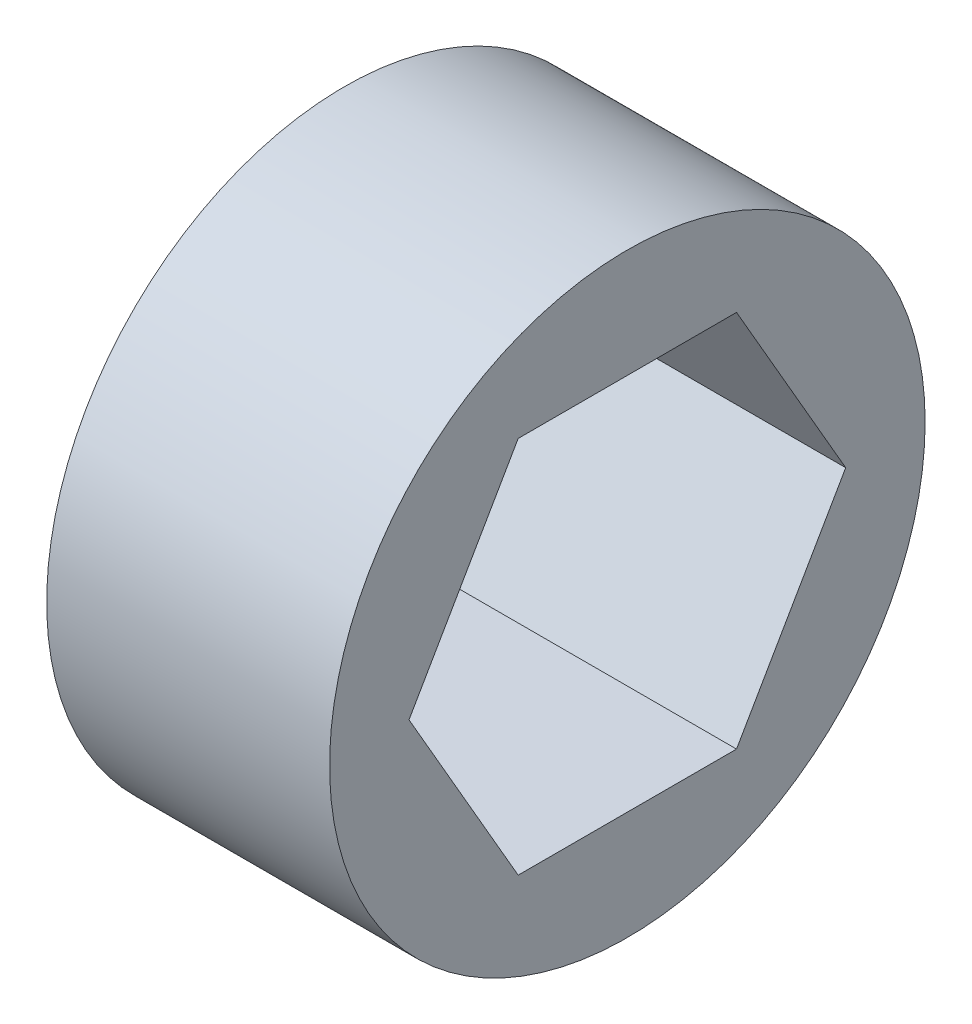
ISO-10303-21;
HEADER;
FILE_DESCRIPTION(('STEP AP214'),'2;1');
FILE_NAME('part.step','',(''),(''),'','','');
FILE_SCHEMA(('AUTOMOTIVE_DESIGN { 1 0 10303 214 1 1 1 1 }'));
ENDSEC;
DATA;
#1=APPLICATION_CONTEXT('core data for automotive mechanical design processes');
#2=APPLICATION_PROTOCOL_DEFINITION('international standard','automotive_design',2000,#1);
#3=PRODUCT_CONTEXT('',#1,'mechanical');
#4=PRODUCT('Part','Part','',(#3));
#5=PRODUCT_RELATED_PRODUCT_CATEGORY('part','',(#4));
#6=PRODUCT_DEFINITION_FORMATION('','',#4);
#7=PRODUCT_DEFINITION_CONTEXT('part definition',#1,'design');
#8=PRODUCT_DEFINITION('design','',#6,#7);
#9=PRODUCT_DEFINITION_SHAPE('','',#8);
#10=(LENGTH_UNIT() NAMED_UNIT(*) SI_UNIT(.MILLI.,.METRE.));
#11=(NAMED_UNIT(*) PLANE_ANGLE_UNIT() SI_UNIT($,.RADIAN.));
#12=(NAMED_UNIT(*) SI_UNIT($,.STERADIAN.) SOLID_ANGLE_UNIT());
#13=UNCERTAINTY_MEASURE_WITH_UNIT(LENGTH_MEASURE(1.E-05),#10,'distance_accuracy_value','');
#14=(GEOMETRIC_REPRESENTATION_CONTEXT(3) GLOBAL_UNCERTAINTY_ASSIGNED_CONTEXT((#13)) GLOBAL_UNIT_ASSIGNED_CONTEXT((#10,
#11,#12)) REPRESENTATION_CONTEXT('',''));
#15=CARTESIAN_POINT('',(0.,0.,0.));
#16=DIRECTION('',(0.,0.,1.));
#17=DIRECTION('',(1.,0.,0.));
#18=AXIS2_PLACEMENT_3D('',#15,#16,#17);
#19=CARTESIAN_POINT('',(9.5,0.,0.));
#20=DIRECTION('',(1.,0.,0.));
#21=DIRECTION('',(0.,0.,-1.));
#22=AXIS2_PLACEMENT_3D('',#19,#20,#21);
#23=PLANE('',#22);
#24=CARTESIAN_POINT('',(9.5,0.,0.));
#25=DIRECTION('',(1.,0.,0.));
#26=DIRECTION('',(0.,0.,-1.));
#27=AXIS2_PLACEMENT_3D('',#24,#25,#26);
#28=CIRCLE('',#27,10.);
#29=CARTESIAN_POINT('',(9.5,0.,-10.));
#30=VERTEX_POINT('',#29);
#31=EDGE_CURVE('E11',#30,#30,#28,.T.);
#32=ORIENTED_EDGE('',*,*,#31,.T.);
#33=EDGE_LOOP('',(#32));
#34=FACE_BOUND('',#33,.T.);
#35=DIRECTION('',(0.,0.866025403784438,0.500000000000001));
#36=VECTOR('',#35,1.);
#37=CARTESIAN_POINT('',(9.5,0.,-7.33234841870825));
#38=LINE('',#37,#36);
#39=CARTESIAN_POINT('',(9.5,0.,-7.33234841870825));
#40=VERTEX_POINT('',#39);
#41=CARTESIAN_POINT('',(9.5,6.35000000000001,-3.66617420935411));
#42=VERTEX_POINT('',#41);
#43=EDGE_CURVE('E102',#40,#42,#38,.T.);
#44=ORIENTED_EDGE('',*,*,#43,.F.);
#45=DIRECTION('',(0.,0.866025403784442,-0.499999999999995));
#46=VECTOR('',#45,1.);
#47=CARTESIAN_POINT('',(9.5,-6.34999999999996,-3.6661742093542));
#48=LINE('',#47,#46);
#49=CARTESIAN_POINT('',(9.5,-6.34999999999996,-3.6661742093542));
#50=VERTEX_POINT('',#49);
#51=EDGE_CURVE('E93',#50,#40,#48,.T.);
#52=ORIENTED_EDGE('',*,*,#51,.F.);
#53=DIRECTION('',(0.,0.,-1.));
#54=VECTOR('',#53,1.);
#55=CARTESIAN_POINT('',(9.5,-6.35000000000003,3.66617420935406));
#56=LINE('',#55,#54);
#57=CARTESIAN_POINT('',(9.5,-6.35000000000003,3.66617420935406));
#58=VERTEX_POINT('',#57);
#59=EDGE_CURVE('E127',#58,#50,#56,.T.);
#60=ORIENTED_EDGE('',*,*,#59,.F.);
#61=DIRECTION('',(0.,-0.866025403784435,-0.500000000000007));
#62=VECTOR('',#61,1.);
#63=CARTESIAN_POINT('',(9.5,0.,7.33234841870824));
#64=LINE('',#63,#62);
#65=CARTESIAN_POINT('',(9.5,0.,7.33234841870824));
#66=VERTEX_POINT('',#65);
#67=EDGE_CURVE('E124',#66,#58,#64,.T.);
#68=ORIENTED_EDGE('',*,*,#67,.F.);
#69=DIRECTION('',(0.,-0.866025403784442,0.499999999999995));
#70=VECTOR('',#69,1.);
#71=CARTESIAN_POINT('',(9.5,6.34999999999998,3.66617420935415));
#72=LINE('',#71,#70);
#73=CARTESIAN_POINT('',(9.5,6.34999999999998,3.66617420935415));
#74=VERTEX_POINT('',#73);
#75=EDGE_CURVE('E119',#74,#66,#72,.T.);
#76=ORIENTED_EDGE('',*,*,#75,.F.);
#77=DIRECTION('',(0.,0.,1.));
#78=VECTOR('',#77,1.);
#79=CARTESIAN_POINT('',(9.5,6.35000000000001,-3.66617420935411));
#80=LINE('',#79,#78);
#81=EDGE_CURVE('E115',#42,#74,#80,.T.);
#82=ORIENTED_EDGE('',*,*,#81,.F.);
#83=EDGE_LOOP('',(#44,#52,#60,#68,#76,#82));
#84=FACE_BOUND('',#83,.T.);
#85=ADVANCED_FACE('F39',(#34,#84),#23,.T.);
#86=CARTESIAN_POINT('',(0.,0.,0.));
#87=DIRECTION('',(1.,0.,0.));
#88=DIRECTION('',(0.,0.,-1.));
#89=AXIS2_PLACEMENT_3D('',#86,#87,#88);
#90=PLANE('',#89);
#91=CARTESIAN_POINT('',(0.,0.,0.));
#92=DIRECTION('',(1.,0.,0.));
#93=DIRECTION('',(0.,0.,-1.));
#94=AXIS2_PLACEMENT_3D('',#91,#92,#93);
#95=CIRCLE('',#94,10.);
#96=CARTESIAN_POINT('',(0.,0.,-10.));
#97=VERTEX_POINT('',#96);
#98=EDGE_CURVE('E43',#97,#97,#95,.T.);
#99=ORIENTED_EDGE('',*,*,#98,.F.);
#100=EDGE_LOOP('',(#99));
#101=FACE_BOUND('',#100,.T.);
#102=DIRECTION('',(0.,0.866025403784442,-0.499999999999995));
#103=VECTOR('',#102,1.);
#104=CARTESIAN_POINT('',(0.,-6.34999999999996,-3.6661742093542));
#105=LINE('',#104,#103);
#106=CARTESIAN_POINT('',(0.,-6.34999999999996,-3.6661742093542));
#107=VERTEX_POINT('',#106);
#108=CARTESIAN_POINT('',(0.,0.,-7.33234841870825));
#109=VERTEX_POINT('',#108);
#110=EDGE_CURVE('E63',#107,#109,#105,.T.);
#111=ORIENTED_EDGE('',*,*,#110,.T.);
#112=DIRECTION('',(0.,0.866025403784438,0.500000000000001));
#113=VECTOR('',#112,1.);
#114=CARTESIAN_POINT('',(0.,0.,-7.33234841870825));
#115=LINE('',#114,#113);
#116=CARTESIAN_POINT('',(0.,6.35000000000001,-3.66617420935411));
#117=VERTEX_POINT('',#116);
#118=EDGE_CURVE('E109',#109,#117,#115,.T.);
#119=ORIENTED_EDGE('',*,*,#118,.T.);
#120=DIRECTION('',(0.,0.,1.));
#121=VECTOR('',#120,1.);
#122=CARTESIAN_POINT('',(0.,6.35000000000001,-3.66617420935411));
#123=LINE('',#122,#121);
#124=CARTESIAN_POINT('',(0.,6.34999999999998,3.66617420935415));
#125=VERTEX_POINT('',#124);
#126=EDGE_CURVE('E134',#117,#125,#123,.T.);
#127=ORIENTED_EDGE('',*,*,#126,.T.);
#128=DIRECTION('',(0.,-0.866025403784442,0.499999999999995));
#129=VECTOR('',#128,1.);
#130=CARTESIAN_POINT('',(0.,6.34999999999998,3.66617420935415));
#131=LINE('',#130,#129);
#132=CARTESIAN_POINT('',(0.,0.,7.33234841870824));
#133=VERTEX_POINT('',#132);
#134=EDGE_CURVE('E138',#125,#133,#131,.T.);
#135=ORIENTED_EDGE('',*,*,#134,.T.);
#136=DIRECTION('',(0.,-0.866025403784435,-0.500000000000007));
#137=VECTOR('',#136,1.);
#138=CARTESIAN_POINT('',(0.,0.,7.33234841870824));
#139=LINE('',#138,#137);
#140=CARTESIAN_POINT('',(0.,-6.35000000000003,3.66617420935406));
#141=VERTEX_POINT('',#140);
#142=EDGE_CURVE('E142',#133,#141,#139,.T.);
#143=ORIENTED_EDGE('',*,*,#142,.T.);
#144=DIRECTION('',(0.,0.,-1.));
#145=VECTOR('',#144,1.);
#146=CARTESIAN_POINT('',(0.,-6.35000000000003,3.66617420935406));
#147=LINE('',#146,#145);
#148=EDGE_CURVE('E103',#141,#107,#147,.T.);
#149=ORIENTED_EDGE('',*,*,#148,.T.);
#150=EDGE_LOOP('',(#111,#119,#127,#135,#143,#149));
#151=FACE_BOUND('',#150,.T.);
#152=ADVANCED_FACE('F166',(#101,#151),#90,.F.);
#153=CARTESIAN_POINT('',(9.5,0.,0.));
#154=DIRECTION('',(-1.,0.,0.));
#155=DIRECTION('',(0.,0.,1.));
#156=AXIS2_PLACEMENT_3D('',#153,#154,#155);
#157=CYLINDRICAL_SURFACE('',#156,10.);
#158=ORIENTED_EDGE('',*,*,#31,.F.);
#159=EDGE_LOOP('',(#158));
#160=FACE_BOUND('',#159,.T.);
#161=ORIENTED_EDGE('',*,*,#98,.T.);
#162=EDGE_LOOP('',(#161));
#163=FACE_BOUND('',#162,.T.);
#164=ADVANCED_FACE('F41',(#160,#163),#157,.T.);
#165=CARTESIAN_POINT('',(9.5,-6.34999999999996,-3.6661742093542));
#166=DIRECTION('',(0.,0.499999999999995,0.866025403784442));
#167=DIRECTION('',(0.,-0.866025403784442,0.499999999999995));
#168=AXIS2_PLACEMENT_3D('',#165,#166,#167);
#169=PLANE('',#168);
#170=ORIENTED_EDGE('',*,*,#110,.F.);
#171=DIRECTION('',(-1.,0.,0.));
#172=VECTOR('',#171,1.);
#173=CARTESIAN_POINT('',(9.5,-6.34999999999996,-3.6661742093542));
#174=LINE('',#173,#172);
#175=EDGE_CURVE('E97',#50,#107,#174,.T.);
#176=ORIENTED_EDGE('',*,*,#175,.F.);
#177=ORIENTED_EDGE('',*,*,#51,.T.);
#178=DIRECTION('',(-1.,0.,0.));
#179=VECTOR('',#178,1.);
#180=CARTESIAN_POINT('',(9.5,0.,-7.33234841870825));
#181=LINE('',#180,#179);
#182=EDGE_CURVE('E96',#40,#109,#181,.T.);
#183=ORIENTED_EDGE('',*,*,#182,.T.);
#184=EDGE_LOOP('',(#170,#176,#177,#183));
#185=FACE_BOUND('',#184,.T.);
#186=ADVANCED_FACE('F95',(#185),#169,.T.);
#187=CARTESIAN_POINT('',(9.5,0.,-7.33234841870825));
#188=DIRECTION('',(0.,-0.500000000000001,0.866025403784438));
#189=DIRECTION('',(0.,-0.866025403784438,-0.500000000000001));
#190=AXIS2_PLACEMENT_3D('',#187,#188,#189);
#191=PLANE('',#190);
#192=ORIENTED_EDGE('',*,*,#118,.F.);
#193=ORIENTED_EDGE('',*,*,#182,.F.);
#194=ORIENTED_EDGE('',*,*,#43,.T.);
#195=DIRECTION('',(-1.,0.,0.));
#196=VECTOR('',#195,1.);
#197=CARTESIAN_POINT('',(9.5,6.35000000000001,-3.66617420935411));
#198=LINE('',#197,#196);
#199=EDGE_CURVE('E111',#42,#117,#198,.T.);
#200=ORIENTED_EDGE('',*,*,#199,.T.);
#201=EDGE_LOOP('',(#192,#193,#194,#200));
#202=FACE_BOUND('',#201,.T.);
#203=ADVANCED_FACE('F106',(#202),#191,.T.);
#204=CARTESIAN_POINT('',(9.5,6.35000000000001,-3.66617420935411));
#205=DIRECTION('',(0.,-1.,0.));
#206=DIRECTION('',(0.,0.,-1.));
#207=AXIS2_PLACEMENT_3D('',#204,#205,#206);
#208=PLANE('',#207);
#209=ORIENTED_EDGE('',*,*,#126,.F.);
#210=ORIENTED_EDGE('',*,*,#199,.F.);
#211=ORIENTED_EDGE('',*,*,#81,.T.);
#212=DIRECTION('',(-1.,0.,0.));
#213=VECTOR('',#212,1.);
#214=CARTESIAN_POINT('',(9.5,6.34999999999998,3.66617420935415));
#215=LINE('',#214,#213);
#216=EDGE_CURVE('E156',#74,#125,#215,.T.);
#217=ORIENTED_EDGE('',*,*,#216,.T.);
#218=EDGE_LOOP('',(#209,#210,#211,#217));
#219=FACE_BOUND('',#218,.T.);
#220=ADVANCED_FACE('F162',(#219),#208,.T.);
#221=CARTESIAN_POINT('',(9.5,6.34999999999998,3.66617420935415));
#222=DIRECTION('',(0.,-0.499999999999995,-0.866025403784442));
#223=DIRECTION('',(0.,0.866025403784442,-0.499999999999995));
#224=AXIS2_PLACEMENT_3D('',#221,#222,#223);
#225=PLANE('',#224);
#226=ORIENTED_EDGE('',*,*,#134,.F.);
#227=ORIENTED_EDGE('',*,*,#216,.F.);
#228=ORIENTED_EDGE('',*,*,#75,.T.);
#229=DIRECTION('',(-1.,0.,0.));
#230=VECTOR('',#229,1.);
#231=CARTESIAN_POINT('',(9.5,0.,7.33234841870824));
#232=LINE('',#231,#230);
#233=EDGE_CURVE('E153',#66,#133,#232,.T.);
#234=ORIENTED_EDGE('',*,*,#233,.T.);
#235=EDGE_LOOP('',(#226,#227,#228,#234));
#236=FACE_BOUND('',#235,.T.);
#237=ADVANCED_FACE('F174',(#236),#225,.T.);
#238=CARTESIAN_POINT('',(9.5,0.,7.33234841870824));
#239=DIRECTION('',(0.,0.500000000000007,-0.866025403784435));
#240=DIRECTION('',(0.,0.866025403784434,0.500000000000007));
#241=AXIS2_PLACEMENT_3D('',#238,#239,#240);
#242=PLANE('',#241);
#243=ORIENTED_EDGE('',*,*,#142,.F.);
#244=ORIENTED_EDGE('',*,*,#233,.F.);
#245=ORIENTED_EDGE('',*,*,#67,.T.);
#246=DIRECTION('',(-1.,0.,0.));
#247=VECTOR('',#246,1.);
#248=CARTESIAN_POINT('',(9.5,-6.35000000000003,3.66617420935406));
#249=LINE('',#248,#247);
#250=EDGE_CURVE('E55',#58,#141,#249,.T.);
#251=ORIENTED_EDGE('',*,*,#250,.T.);
#252=EDGE_LOOP('',(#243,#244,#245,#251));
#253=FACE_BOUND('',#252,.T.);
#254=ADVANCED_FACE('F172',(#253),#242,.T.);
#255=CARTESIAN_POINT('',(9.5,-6.35000000000003,3.66617420935406));
#256=DIRECTION('',(0.,1.,0.));
#257=DIRECTION('',(0.,0.,1.));
#258=AXIS2_PLACEMENT_3D('',#255,#256,#257);
#259=PLANE('',#258);
#260=ORIENTED_EDGE('',*,*,#148,.F.);
#261=ORIENTED_EDGE('',*,*,#250,.F.);
#262=ORIENTED_EDGE('',*,*,#59,.T.);
#263=ORIENTED_EDGE('',*,*,#175,.T.);
#264=EDGE_LOOP('',(#260,#261,#262,#263));
#265=FACE_BOUND('',#264,.T.);
#266=ADVANCED_FACE('F168',(#265),#259,.T.);
#267=CLOSED_SHELL('',(#85,#152,#164,#186,#203,#220,#237,#254,#266));
#268=MANIFOLD_SOLID_BREP('B2',#267);
#269=ADVANCED_BREP_SHAPE_REPRESENTATION('',(#18,#268),#14);
#270=SHAPE_DEFINITION_REPRESENTATION(#9,#269);
ENDSEC;
END-ISO-10303-21;
